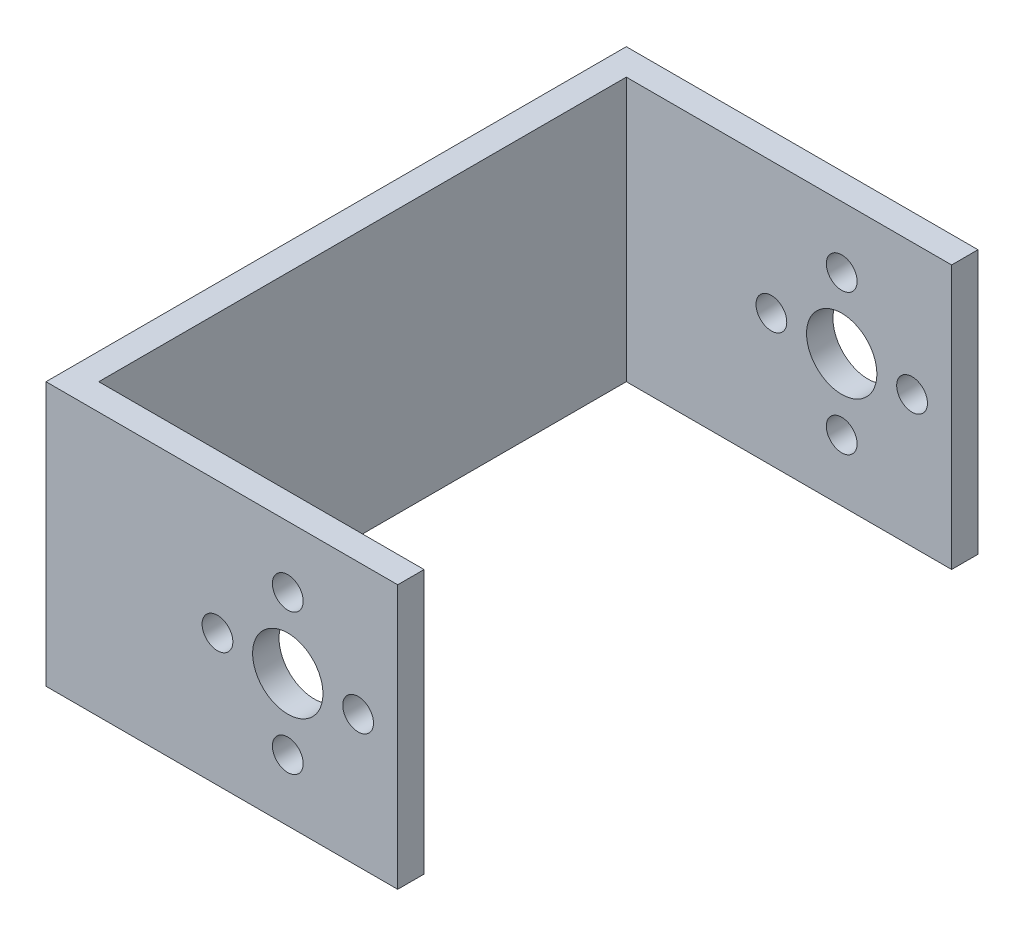
ISO-10303-21;
HEADER;
FILE_DESCRIPTION(('STEP AP214'),'2;1');
FILE_NAME('part.step','',(''),(''),'','','');
FILE_SCHEMA(('AUTOMOTIVE_DESIGN { 1 0 10303 214 1 1 1 1 }'));
ENDSEC;
DATA;
#1=APPLICATION_CONTEXT('core data for automotive mechanical design processes');
#2=APPLICATION_PROTOCOL_DEFINITION('international standard','automotive_design',2000,#1);
#3=PRODUCT_CONTEXT('',#1,'mechanical');
#4=PRODUCT('Part','Part','',(#3));
#5=PRODUCT_RELATED_PRODUCT_CATEGORY('part','',(#4));
#6=PRODUCT_DEFINITION_FORMATION('','',#4);
#7=PRODUCT_DEFINITION_CONTEXT('part definition',#1,'design');
#8=PRODUCT_DEFINITION('design','',#6,#7);
#9=PRODUCT_DEFINITION_SHAPE('','',#8);
#10=(LENGTH_UNIT() NAMED_UNIT(*) SI_UNIT(.MILLI.,.METRE.));
#11=(NAMED_UNIT(*) PLANE_ANGLE_UNIT() SI_UNIT($,.RADIAN.));
#12=(NAMED_UNIT(*) SI_UNIT($,.STERADIAN.) SOLID_ANGLE_UNIT());
#13=UNCERTAINTY_MEASURE_WITH_UNIT(LENGTH_MEASURE(1.E-05),#10,'distance_accuracy_value','');
#14=(GEOMETRIC_REPRESENTATION_CONTEXT(3) GLOBAL_UNCERTAINTY_ASSIGNED_CONTEXT((#13)) GLOBAL_UNIT_ASSIGNED_CONTEXT((#10,
#11,#12)) REPRESENTATION_CONTEXT('',''));
#15=CARTESIAN_POINT('',(0.,0.,0.));
#16=DIRECTION('',(0.,0.,1.));
#17=DIRECTION('',(1.,0.,0.));
#18=AXIS2_PLACEMENT_3D('',#15,#16,#17);
#19=CARTESIAN_POINT('',(40.,30.,0.));
#20=DIRECTION('',(0.,0.,-1.));
#21=DIRECTION('',(-1.,0.,0.));
#22=AXIS2_PLACEMENT_3D('',#19,#20,#21);
#23=PLANE('',#22);
#24=CARTESIAN_POINT('',(19.5,15.,0.));
#25=DIRECTION('',(0.,0.,1.));
#26=DIRECTION('',(1.,0.,0.));
#27=AXIS2_PLACEMENT_3D('',#24,#25,#26);
#28=CIRCLE('',#27,1.75);
#29=CARTESIAN_POINT('',(21.25,15.,0.));
#30=VERTEX_POINT('',#29);
#31=EDGE_CURVE('E264',#30,#30,#28,.T.);
#32=ORIENTED_EDGE('',*,*,#31,.F.);
#33=EDGE_LOOP('',(#32));
#34=FACE_BOUND('',#33,.T.);
#35=CARTESIAN_POINT('',(27.5,23.,0.));
#36=DIRECTION('',(0.,0.,1.));
#37=DIRECTION('',(1.,0.,0.));
#38=AXIS2_PLACEMENT_3D('',#35,#36,#37);
#39=CIRCLE('',#38,1.75);
#40=CARTESIAN_POINT('',(29.25,23.,0.));
#41=VERTEX_POINT('',#40);
#42=EDGE_CURVE('E255',#41,#41,#39,.T.);
#43=ORIENTED_EDGE('',*,*,#42,.F.);
#44=EDGE_LOOP('',(#43));
#45=FACE_BOUND('',#44,.T.);
#46=CARTESIAN_POINT('',(35.5,15.,0.));
#47=DIRECTION('',(0.,0.,1.));
#48=DIRECTION('',(1.,0.,0.));
#49=AXIS2_PLACEMENT_3D('',#46,#47,#48);
#50=CIRCLE('',#49,1.75);
#51=CARTESIAN_POINT('',(37.25,15.,0.));
#52=VERTEX_POINT('',#51);
#53=EDGE_CURVE('E279',#52,#52,#50,.T.);
#54=ORIENTED_EDGE('',*,*,#53,.F.);
#55=EDGE_LOOP('',(#54));
#56=FACE_BOUND('',#55,.T.);
#57=CARTESIAN_POINT('',(27.5,6.99999999999997,0.));
#58=DIRECTION('',(0.,0.,1.));
#59=DIRECTION('',(1.,0.,0.));
#60=AXIS2_PLACEMENT_3D('',#57,#58,#59);
#61=CIRCLE('',#60,1.75);
#62=CARTESIAN_POINT('',(29.25,6.99999999999997,0.));
#63=VERTEX_POINT('',#62);
#64=EDGE_CURVE('E271',#63,#63,#61,.T.);
#65=ORIENTED_EDGE('',*,*,#64,.F.);
#66=EDGE_LOOP('',(#65));
#67=FACE_BOUND('',#66,.T.);
#68=CARTESIAN_POINT('',(27.5,15.,0.));
#69=DIRECTION('',(0.,0.,1.));
#70=DIRECTION('',(1.,0.,0.));
#71=AXIS2_PLACEMENT_3D('',#68,#69,#70);
#72=CIRCLE('',#71,4.00000000000001);
#73=CARTESIAN_POINT('',(31.5,15.,0.));
#74=VERTEX_POINT('',#73);
#75=EDGE_CURVE('E247',#74,#74,#72,.T.);
#76=ORIENTED_EDGE('',*,*,#75,.F.);
#77=EDGE_LOOP('',(#76));
#78=FACE_BOUND('',#77,.T.);
#79=DIRECTION('',(1.,0.,0.));
#80=VECTOR('',#79,1.);
#81=CARTESIAN_POINT('',(40.,0.,0.));
#82=LINE('',#81,#80);
#83=CARTESIAN_POINT('',(0.,0.,0.));
#84=VERTEX_POINT('',#83);
#85=CARTESIAN_POINT('',(40.,0.,0.));
#86=VERTEX_POINT('',#85);
#87=EDGE_CURVE('E140',#84,#86,#82,.T.);
#88=ORIENTED_EDGE('',*,*,#87,.T.);
#89=DIRECTION('',(0.,-1.,0.));
#90=VECTOR('',#89,1.);
#91=CARTESIAN_POINT('',(40.,30.,0.));
#92=LINE('',#91,#90);
#93=CARTESIAN_POINT('',(40.,30.,0.));
#94=VERTEX_POINT('',#93);
#95=EDGE_CURVE('E11',#94,#86,#92,.T.);
#96=ORIENTED_EDGE('',*,*,#95,.F.);
#97=DIRECTION('',(1.,0.,0.));
#98=VECTOR('',#97,1.);
#99=CARTESIAN_POINT('',(40.,30.,0.));
#100=LINE('',#99,#98);
#101=CARTESIAN_POINT('',(0.,30.,0.));
#102=VERTEX_POINT('',#101);
#103=EDGE_CURVE('E163',#102,#94,#100,.T.);
#104=ORIENTED_EDGE('',*,*,#103,.F.);
#105=DIRECTION('',(0.,-1.,0.));
#106=VECTOR('',#105,1.);
#107=CARTESIAN_POINT('',(0.,30.,0.));
#108=LINE('',#107,#106);
#109=EDGE_CURVE('E136',#102,#84,#108,.T.);
#110=ORIENTED_EDGE('',*,*,#109,.T.);
#111=EDGE_LOOP('',(#88,#96,#104,#110));
#112=FACE_BOUND('',#111,.T.);
#113=ADVANCED_FACE('F39',(#34,#45,#56,#67,#78,#112),#23,.F.);
#114=CARTESIAN_POINT('',(40.,30.,-3.));
#115=DIRECTION('',(-1.,0.,0.));
#116=DIRECTION('',(0.,0.,1.));
#117=AXIS2_PLACEMENT_3D('',#114,#115,#116);
#118=PLANE('',#117);
#119=DIRECTION('',(0.,0.,-1.));
#120=VECTOR('',#119,1.);
#121=CARTESIAN_POINT('',(40.,0.,-3.));
#122=LINE('',#121,#120);
#123=CARTESIAN_POINT('',(40.,0.,-3.));
#124=VERTEX_POINT('',#123);
#125=EDGE_CURVE('E144',#86,#124,#122,.T.);
#126=ORIENTED_EDGE('',*,*,#125,.T.);
#127=DIRECTION('',(0.,-1.,0.));
#128=VECTOR('',#127,1.);
#129=CARTESIAN_POINT('',(40.,30.,-3.));
#130=LINE('',#129,#128);
#131=CARTESIAN_POINT('',(40.,30.,-3.));
#132=VERTEX_POINT('',#131);
#133=EDGE_CURVE('E48',#132,#124,#130,.T.);
#134=ORIENTED_EDGE('',*,*,#133,.F.);
#135=DIRECTION('',(0.,0.,-1.));
#136=VECTOR('',#135,1.);
#137=CARTESIAN_POINT('',(40.,30.,-3.));
#138=LINE('',#137,#136);
#139=EDGE_CURVE('E99',#94,#132,#138,.T.);
#140=ORIENTED_EDGE('',*,*,#139,.F.);
#141=ORIENTED_EDGE('',*,*,#95,.T.);
#142=EDGE_LOOP('',(#126,#134,#140,#141));
#143=FACE_BOUND('',#142,.T.);
#144=ADVANCED_FACE('F326',(#143),#118,.F.);
#145=CARTESIAN_POINT('',(3.,30.,-3.));
#146=DIRECTION('',(0.,0.,1.));
#147=DIRECTION('',(1.,0.,0.));
#148=AXIS2_PLACEMENT_3D('',#145,#146,#147);
#149=PLANE('',#148);
#150=CARTESIAN_POINT('',(19.5,15.,-3.));
#151=DIRECTION('',(0.,0.,1.));
#152=DIRECTION('',(1.,0.,0.));
#153=AXIS2_PLACEMENT_3D('',#150,#151,#152);
#154=CIRCLE('',#153,1.75);
#155=CARTESIAN_POINT('',(21.25,15.,-3.));
#156=VERTEX_POINT('',#155);
#157=EDGE_CURVE('E145',#156,#156,#154,.T.);
#158=ORIENTED_EDGE('',*,*,#157,.T.);
#159=EDGE_LOOP('',(#158));
#160=FACE_BOUND('',#159,.T.);
#161=CARTESIAN_POINT('',(27.5,23.,-3.));
#162=DIRECTION('',(0.,0.,1.));
#163=DIRECTION('',(1.,0.,0.));
#164=AXIS2_PLACEMENT_3D('',#161,#162,#163);
#165=CIRCLE('',#164,1.75);
#166=CARTESIAN_POINT('',(29.25,23.,-3.));
#167=VERTEX_POINT('',#166);
#168=EDGE_CURVE('E214',#167,#167,#165,.T.);
#169=ORIENTED_EDGE('',*,*,#168,.T.);
#170=EDGE_LOOP('',(#169));
#171=FACE_BOUND('',#170,.T.);
#172=CARTESIAN_POINT('',(35.5,15.,-3.00000000000002));
#173=DIRECTION('',(0.,0.,1.));
#174=DIRECTION('',(1.,0.,0.));
#175=AXIS2_PLACEMENT_3D('',#172,#173,#174);
#176=CIRCLE('',#175,1.75);
#177=CARTESIAN_POINT('',(37.25,15.,-3.00000000000002));
#178=VERTEX_POINT('',#177);
#179=EDGE_CURVE('E222',#178,#178,#176,.T.);
#180=ORIENTED_EDGE('',*,*,#179,.T.);
#181=EDGE_LOOP('',(#180));
#182=FACE_BOUND('',#181,.T.);
#183=CARTESIAN_POINT('',(27.5,6.99999999999997,-3.));
#184=DIRECTION('',(0.,0.,1.));
#185=DIRECTION('',(1.,0.,0.));
#186=AXIS2_PLACEMENT_3D('',#183,#184,#185);
#187=CIRCLE('',#186,1.75);
#188=CARTESIAN_POINT('',(29.25,6.99999999999997,-3.));
#189=VERTEX_POINT('',#188);
#190=EDGE_CURVE('E230',#189,#189,#187,.T.);
#191=ORIENTED_EDGE('',*,*,#190,.T.);
#192=EDGE_LOOP('',(#191));
#193=FACE_BOUND('',#192,.T.);
#194=CARTESIAN_POINT('',(27.5,15.,-3.));
#195=DIRECTION('',(0.,0.,1.));
#196=DIRECTION('',(1.,0.,0.));
#197=AXIS2_PLACEMENT_3D('',#194,#195,#196);
#198=CIRCLE('',#197,4.00000000000001);
#199=CARTESIAN_POINT('',(31.5,15.,-3.));
#200=VERTEX_POINT('',#199);
#201=EDGE_CURVE('E238',#200,#200,#198,.T.);
#202=ORIENTED_EDGE('',*,*,#201,.T.);
#203=EDGE_LOOP('',(#202));
#204=FACE_BOUND('',#203,.T.);
#205=DIRECTION('',(-1.,0.,0.));
#206=VECTOR('',#205,1.);
#207=CARTESIAN_POINT('',(3.,0.,-3.));
#208=LINE('',#207,#206);
#209=CARTESIAN_POINT('',(3.,0.,-3.));
#210=VERTEX_POINT('',#209);
#211=EDGE_CURVE('E148',#124,#210,#208,.T.);
#212=ORIENTED_EDGE('',*,*,#211,.T.);
#213=DIRECTION('',(0.,-1.,0.));
#214=VECTOR('',#213,1.);
#215=CARTESIAN_POINT('',(3.,30.,-3.));
#216=LINE('',#215,#214);
#217=CARTESIAN_POINT('',(3.,30.,-3.));
#218=VERTEX_POINT('',#217);
#219=EDGE_CURVE('E174',#218,#210,#216,.T.);
#220=ORIENTED_EDGE('',*,*,#219,.F.);
#221=DIRECTION('',(-1.,0.,0.));
#222=VECTOR('',#221,1.);
#223=CARTESIAN_POINT('',(3.,30.,-3.));
#224=LINE('',#223,#222);
#225=EDGE_CURVE('E184',#132,#218,#224,.T.);
#226=ORIENTED_EDGE('',*,*,#225,.F.);
#227=ORIENTED_EDGE('',*,*,#133,.T.);
#228=EDGE_LOOP('',(#212,#220,#226,#227));
#229=FACE_BOUND('',#228,.T.);
#230=ADVANCED_FACE('F182',(#160,#171,#182,#193,#204,#229),#149,.F.);
#231=CARTESIAN_POINT('',(2.99999999999999,30.,-63.));
#232=DIRECTION('',(-1.,0.,0.));
#233=DIRECTION('',(0.,0.,1.));
#234=AXIS2_PLACEMENT_3D('',#231,#232,#233);
#235=PLANE('',#234);
#236=DIRECTION('',(0.,0.,-1.));
#237=VECTOR('',#236,1.);
#238=CARTESIAN_POINT('',(2.99999999999999,0.,-63.));
#239=LINE('',#238,#237);
#240=CARTESIAN_POINT('',(2.99999999999999,0.,-63.));
#241=VERTEX_POINT('',#240);
#242=EDGE_CURVE('E151',#210,#241,#239,.T.);
#243=ORIENTED_EDGE('',*,*,#242,.T.);
#244=DIRECTION('',(0.,-1.,0.));
#245=VECTOR('',#244,1.);
#246=CARTESIAN_POINT('',(2.99999999999999,30.,-63.));
#247=LINE('',#246,#245);
#248=CARTESIAN_POINT('',(2.99999999999999,30.,-63.));
#249=VERTEX_POINT('',#248);
#250=EDGE_CURVE('E170',#249,#241,#247,.T.);
#251=ORIENTED_EDGE('',*,*,#250,.F.);
#252=DIRECTION('',(0.,0.,-1.));
#253=VECTOR('',#252,1.);
#254=CARTESIAN_POINT('',(2.99999999999999,30.,-63.));
#255=LINE('',#254,#253);
#256=EDGE_CURVE('E197',#218,#249,#255,.T.);
#257=ORIENTED_EDGE('',*,*,#256,.F.);
#258=ORIENTED_EDGE('',*,*,#219,.T.);
#259=EDGE_LOOP('',(#243,#251,#257,#258));
#260=FACE_BOUND('',#259,.T.);
#261=ADVANCED_FACE('F192',(#260),#235,.F.);
#262=CARTESIAN_POINT('',(2.99999999999999,30.,-63.));
#263=DIRECTION('',(0.,0.,-1.));
#264=DIRECTION('',(-1.,0.,0.));
#265=AXIS2_PLACEMENT_3D('',#262,#263,#264);
#266=PLANE('',#265);
#267=CARTESIAN_POINT('',(19.5,15.,-63.));
#268=DIRECTION('',(0.,0.,-1.));
#269=DIRECTION('',(-1.,0.,0.));
#270=AXIS2_PLACEMENT_3D('',#267,#268,#269);
#271=CIRCLE('',#270,1.75);
#272=CARTESIAN_POINT('',(17.75,15.,-63.));
#273=VERTEX_POINT('',#272);
#274=EDGE_CURVE('E210',#273,#273,#271,.T.);
#275=ORIENTED_EDGE('',*,*,#274,.T.);
#276=EDGE_LOOP('',(#275));
#277=FACE_BOUND('',#276,.T.);
#278=CARTESIAN_POINT('',(27.5,23.,-63.));
#279=DIRECTION('',(0.,0.,-1.));
#280=DIRECTION('',(-1.,0.,0.));
#281=AXIS2_PLACEMENT_3D('',#278,#279,#280);
#282=CIRCLE('',#281,1.75);
#283=CARTESIAN_POINT('',(25.75,23.,-63.));
#284=VERTEX_POINT('',#283);
#285=EDGE_CURVE('E218',#284,#284,#282,.T.);
#286=ORIENTED_EDGE('',*,*,#285,.T.);
#287=EDGE_LOOP('',(#286));
#288=FACE_BOUND('',#287,.T.);
#289=CARTESIAN_POINT('',(35.5,15.,-63.));
#290=DIRECTION('',(0.,0.,-1.));
#291=DIRECTION('',(-1.,0.,0.));
#292=AXIS2_PLACEMENT_3D('',#289,#290,#291);
#293=CIRCLE('',#292,1.75);
#294=CARTESIAN_POINT('',(33.75,15.,-63.));
#295=VERTEX_POINT('',#294);
#296=EDGE_CURVE('E226',#295,#295,#293,.T.);
#297=ORIENTED_EDGE('',*,*,#296,.T.);
#298=EDGE_LOOP('',(#297));
#299=FACE_BOUND('',#298,.T.);
#300=CARTESIAN_POINT('',(27.5,6.99999999999997,-63.));
#301=DIRECTION('',(0.,0.,-1.));
#302=DIRECTION('',(-1.,0.,0.));
#303=AXIS2_PLACEMENT_3D('',#300,#301,#302);
#304=CIRCLE('',#303,1.75);
#305=CARTESIAN_POINT('',(25.75,6.99999999999997,-63.));
#306=VERTEX_POINT('',#305);
#307=EDGE_CURVE('E234',#306,#306,#304,.T.);
#308=ORIENTED_EDGE('',*,*,#307,.T.);
#309=EDGE_LOOP('',(#308));
#310=FACE_BOUND('',#309,.T.);
#311=CARTESIAN_POINT('',(27.5,15.,-63.));
#312=DIRECTION('',(0.,0.,-1.));
#313=DIRECTION('',(-1.,0.,0.));
#314=AXIS2_PLACEMENT_3D('',#311,#312,#313);
#315=CIRCLE('',#314,4.00000000000001);
#316=CARTESIAN_POINT('',(23.5,15.,-63.));
#317=VERTEX_POINT('',#316);
#318=EDGE_CURVE('E242',#317,#317,#315,.T.);
#319=ORIENTED_EDGE('',*,*,#318,.T.);
#320=EDGE_LOOP('',(#319));
#321=FACE_BOUND('',#320,.T.);
#322=DIRECTION('',(1.,0.,0.));
#323=VECTOR('',#322,1.);
#324=CARTESIAN_POINT('',(2.99999999999999,0.,-63.));
#325=LINE('',#324,#323);
#326=CARTESIAN_POINT('',(40.,0.,-63.));
#327=VERTEX_POINT('',#326);
#328=EDGE_CURVE('E154',#241,#327,#325,.T.);
#329=ORIENTED_EDGE('',*,*,#328,.T.);
#330=DIRECTION('',(0.,-1.,0.));
#331=VECTOR('',#330,1.);
#332=CARTESIAN_POINT('',(40.,30.,-63.));
#333=LINE('',#332,#331);
#334=CARTESIAN_POINT('',(40.,30.,-63.));
#335=VERTEX_POINT('',#334);
#336=EDGE_CURVE('E129',#335,#327,#333,.T.);
#337=ORIENTED_EDGE('',*,*,#336,.F.);
#338=DIRECTION('',(1.,0.,0.));
#339=VECTOR('',#338,1.);
#340=CARTESIAN_POINT('',(2.99999999999999,30.,-63.));
#341=LINE('',#340,#339);
#342=EDGE_CURVE('E118',#249,#335,#341,.T.);
#343=ORIENTED_EDGE('',*,*,#342,.F.);
#344=ORIENTED_EDGE('',*,*,#250,.T.);
#345=EDGE_LOOP('',(#329,#337,#343,#344));
#346=FACE_BOUND('',#345,.T.);
#347=ADVANCED_FACE('F195',(#277,#288,#299,#310,#321,#346),#266,.F.);
#348=CARTESIAN_POINT('',(40.,30.,-63.));
#349=DIRECTION('',(-1.,0.,0.));
#350=DIRECTION('',(0.,0.,1.));
#351=AXIS2_PLACEMENT_3D('',#348,#349,#350);
#352=PLANE('',#351);
#353=DIRECTION('',(0.,0.,-1.));
#354=VECTOR('',#353,1.);
#355=CARTESIAN_POINT('',(40.,0.,-63.));
#356=LINE('',#355,#354);
#357=CARTESIAN_POINT('',(40.,0.,-66.));
#358=VERTEX_POINT('',#357);
#359=EDGE_CURVE('E127',#327,#358,#356,.T.);
#360=ORIENTED_EDGE('',*,*,#359,.T.);
#361=DIRECTION('',(0.,-1.,0.));
#362=VECTOR('',#361,1.);
#363=CARTESIAN_POINT('',(40.,30.,-66.));
#364=LINE('',#363,#362);
#365=CARTESIAN_POINT('',(40.,30.,-66.));
#366=VERTEX_POINT('',#365);
#367=EDGE_CURVE('E124',#366,#358,#364,.T.);
#368=ORIENTED_EDGE('',*,*,#367,.F.);
#369=DIRECTION('',(0.,0.,-1.));
#370=VECTOR('',#369,1.);
#371=CARTESIAN_POINT('',(40.,30.,-63.));
#372=LINE('',#371,#370);
#373=EDGE_CURVE('E112',#335,#366,#372,.T.);
#374=ORIENTED_EDGE('',*,*,#373,.F.);
#375=ORIENTED_EDGE('',*,*,#336,.T.);
#376=EDGE_LOOP('',(#360,#368,#374,#375));
#377=FACE_BOUND('',#376,.T.);
#378=ADVANCED_FACE('F125',(#377),#352,.F.);
#379=CARTESIAN_POINT('',(40.,30.,-66.));
#380=DIRECTION('',(0.,0.,1.));
#381=DIRECTION('',(1.,0.,0.));
#382=AXIS2_PLACEMENT_3D('',#379,#380,#381);
#383=PLANE('',#382);
#384=CARTESIAN_POINT('',(19.5,15.,-66.));
#385=DIRECTION('',(0.,0.,1.));
#386=DIRECTION('',(1.,0.,0.));
#387=AXIS2_PLACEMENT_3D('',#384,#385,#386);
#388=CIRCLE('',#387,1.75);
#389=CARTESIAN_POINT('',(21.25,15.,-66.));
#390=VERTEX_POINT('',#389);
#391=EDGE_CURVE('E251',#390,#390,#388,.T.);
#392=ORIENTED_EDGE('',*,*,#391,.T.);
#393=EDGE_LOOP('',(#392));
#394=FACE_BOUND('',#393,.T.);
#395=CARTESIAN_POINT('',(27.5,23.,-66.));
#396=DIRECTION('',(0.,0.,1.));
#397=DIRECTION('',(1.,0.,0.));
#398=AXIS2_PLACEMENT_3D('',#395,#396,#397);
#399=CIRCLE('',#398,1.75);
#400=CARTESIAN_POINT('',(29.25,23.,-66.));
#401=VERTEX_POINT('',#400);
#402=EDGE_CURVE('E259',#401,#401,#399,.T.);
#403=ORIENTED_EDGE('',*,*,#402,.T.);
#404=EDGE_LOOP('',(#403));
#405=FACE_BOUND('',#404,.T.);
#406=CARTESIAN_POINT('',(35.5,15.,-66.));
#407=DIRECTION('',(0.,0.,1.));
#408=DIRECTION('',(1.,0.,0.));
#409=AXIS2_PLACEMENT_3D('',#406,#407,#408);
#410=CIRCLE('',#409,1.75);
#411=CARTESIAN_POINT('',(37.25,15.,-66.));
#412=VERTEX_POINT('',#411);
#413=EDGE_CURVE('E260',#412,#412,#410,.T.);
#414=ORIENTED_EDGE('',*,*,#413,.T.);
#415=EDGE_LOOP('',(#414));
#416=FACE_BOUND('',#415,.T.);
#417=CARTESIAN_POINT('',(27.5,6.99999999999997,-66.));
#418=DIRECTION('',(0.,0.,1.));
#419=DIRECTION('',(1.,0.,0.));
#420=AXIS2_PLACEMENT_3D('',#417,#418,#419);
#421=CIRCLE('',#420,1.75);
#422=CARTESIAN_POINT('',(29.25,6.99999999999997,-66.));
#423=VERTEX_POINT('',#422);
#424=EDGE_CURVE('E275',#423,#423,#421,.T.);
#425=ORIENTED_EDGE('',*,*,#424,.T.);
#426=EDGE_LOOP('',(#425));
#427=FACE_BOUND('',#426,.T.);
#428=CARTESIAN_POINT('',(27.5,15.,-66.));
#429=DIRECTION('',(0.,0.,1.));
#430=DIRECTION('',(1.,0.,0.));
#431=AXIS2_PLACEMENT_3D('',#428,#429,#430);
#432=CIRCLE('',#431,4.00000000000001);
#433=CARTESIAN_POINT('',(31.5,15.,-66.));
#434=VERTEX_POINT('',#433);
#435=EDGE_CURVE('E246',#434,#434,#432,.T.);
#436=ORIENTED_EDGE('',*,*,#435,.T.);
#437=EDGE_LOOP('',(#436));
#438=FACE_BOUND('',#437,.T.);
#439=DIRECTION('',(-1.,0.,0.));
#440=VECTOR('',#439,1.);
#441=CARTESIAN_POINT('',(40.,0.,-66.));
#442=LINE('',#441,#440);
#443=CARTESIAN_POINT('',(0.,0.,-66.));
#444=VERTEX_POINT('',#443);
#445=EDGE_CURVE('E85',#358,#444,#442,.T.);
#446=ORIENTED_EDGE('',*,*,#445,.T.);
#447=DIRECTION('',(0.,-1.,0.));
#448=VECTOR('',#447,1.);
#449=CARTESIAN_POINT('',(0.,30.,-66.));
#450=LINE('',#449,#448);
#451=CARTESIAN_POINT('',(0.,30.,-66.));
#452=VERTEX_POINT('',#451);
#453=EDGE_CURVE('E130',#452,#444,#450,.T.);
#454=ORIENTED_EDGE('',*,*,#453,.F.);
#455=DIRECTION('',(-1.,0.,0.));
#456=VECTOR('',#455,1.);
#457=CARTESIAN_POINT('',(40.,30.,-66.));
#458=LINE('',#457,#456);
#459=EDGE_CURVE('E116',#366,#452,#458,.T.);
#460=ORIENTED_EDGE('',*,*,#459,.F.);
#461=ORIENTED_EDGE('',*,*,#367,.T.);
#462=EDGE_LOOP('',(#446,#454,#460,#461));
#463=FACE_BOUND('',#462,.T.);
#464=ADVANCED_FACE('F132',(#394,#405,#416,#427,#438,#463),#383,.F.);
#465=CARTESIAN_POINT('',(0.,30.,0.));
#466=DIRECTION('',(1.,0.,0.));
#467=DIRECTION('',(0.,0.,-1.));
#468=AXIS2_PLACEMENT_3D('',#465,#466,#467);
#469=PLANE('',#468);
#470=DIRECTION('',(0.,0.,1.));
#471=VECTOR('',#470,1.);
#472=CARTESIAN_POINT('',(0.,0.,0.));
#473=LINE('',#472,#471);
#474=EDGE_CURVE('E91',#444,#84,#473,.T.);
#475=ORIENTED_EDGE('',*,*,#474,.T.);
#476=ORIENTED_EDGE('',*,*,#109,.F.);
#477=DIRECTION('',(0.,0.,1.));
#478=VECTOR('',#477,1.);
#479=CARTESIAN_POINT('',(0.,30.,0.));
#480=LINE('',#479,#478);
#481=EDGE_CURVE('E56',#452,#102,#480,.T.);
#482=ORIENTED_EDGE('',*,*,#481,.F.);
#483=ORIENTED_EDGE('',*,*,#453,.T.);
#484=EDGE_LOOP('',(#475,#476,#482,#483));
#485=FACE_BOUND('',#484,.T.);
#486=ADVANCED_FACE('F343',(#485),#469,.F.);
#487=CARTESIAN_POINT('',(0.,30.,0.));
#488=DIRECTION('',(0.,-1.,0.));
#489=DIRECTION('',(0.,0.,-1.));
#490=AXIS2_PLACEMENT_3D('',#487,#488,#489);
#491=PLANE('',#490);
#492=ORIENTED_EDGE('',*,*,#103,.T.);
#493=ORIENTED_EDGE('',*,*,#139,.T.);
#494=ORIENTED_EDGE('',*,*,#225,.T.);
#495=ORIENTED_EDGE('',*,*,#256,.T.);
#496=ORIENTED_EDGE('',*,*,#342,.T.);
#497=ORIENTED_EDGE('',*,*,#373,.T.);
#498=ORIENTED_EDGE('',*,*,#459,.T.);
#499=ORIENTED_EDGE('',*,*,#481,.T.);
#500=EDGE_LOOP('',(#492,#493,#494,#495,#496,#497,#498,#499));
#501=FACE_BOUND('',#500,.T.);
#502=ADVANCED_FACE('F114',(#501),#491,.F.);
#503=CARTESIAN_POINT('',(0.,0.,0.));
#504=DIRECTION('',(0.,-1.,0.));
#505=DIRECTION('',(0.,0.,-1.));
#506=AXIS2_PLACEMENT_3D('',#503,#504,#505);
#507=PLANE('',#506);
#508=ORIENTED_EDGE('',*,*,#87,.F.);
#509=ORIENTED_EDGE('',*,*,#474,.F.);
#510=ORIENTED_EDGE('',*,*,#445,.F.);
#511=ORIENTED_EDGE('',*,*,#359,.F.);
#512=ORIENTED_EDGE('',*,*,#328,.F.);
#513=ORIENTED_EDGE('',*,*,#242,.F.);
#514=ORIENTED_EDGE('',*,*,#211,.F.);
#515=ORIENTED_EDGE('',*,*,#125,.F.);
#516=EDGE_LOOP('',(#508,#509,#510,#511,#512,#513,#514,#515));
#517=FACE_BOUND('',#516,.T.);
#518=ADVANCED_FACE('F188',(#517),#507,.T.);
#519=CARTESIAN_POINT('',(27.5,15.,-66.));
#520=DIRECTION('',(0.,0.,1.));
#521=DIRECTION('',(1.,0.,0.));
#522=AXIS2_PLACEMENT_3D('',#519,#520,#521);
#523=CYLINDRICAL_SURFACE('',#522,4.00000000000001);
#524=ORIENTED_EDGE('',*,*,#435,.F.);
#525=EDGE_LOOP('',(#524));
#526=FACE_BOUND('',#525,.T.);
#527=ORIENTED_EDGE('',*,*,#318,.F.);
#528=EDGE_LOOP('',(#527));
#529=FACE_BOUND('',#528,.T.);
#530=ADVANCED_FACE('F306',(#526,#529),#523,.F.);
#531=CARTESIAN_POINT('',(27.5,6.99999999999997,-66.));
#532=DIRECTION('',(0.,0.,1.));
#533=DIRECTION('',(1.,0.,0.));
#534=AXIS2_PLACEMENT_3D('',#531,#532,#533);
#535=CYLINDRICAL_SURFACE('',#534,1.75);
#536=ORIENTED_EDGE('',*,*,#424,.F.);
#537=EDGE_LOOP('',(#536));
#538=FACE_BOUND('',#537,.T.);
#539=ORIENTED_EDGE('',*,*,#307,.F.);
#540=EDGE_LOOP('',(#539));
#541=FACE_BOUND('',#540,.T.);
#542=ADVANCED_FACE('F293',(#538,#541),#535,.F.);
#543=CARTESIAN_POINT('',(35.5,15.,-66.));
#544=DIRECTION('',(0.,0.,1.));
#545=DIRECTION('',(1.,0.,0.));
#546=AXIS2_PLACEMENT_3D('',#543,#544,#545);
#547=CYLINDRICAL_SURFACE('',#546,1.75);
#548=ORIENTED_EDGE('',*,*,#413,.F.);
#549=EDGE_LOOP('',(#548));
#550=FACE_BOUND('',#549,.T.);
#551=ORIENTED_EDGE('',*,*,#296,.F.);
#552=EDGE_LOOP('',(#551));
#553=FACE_BOUND('',#552,.T.);
#554=ADVANCED_FACE('F289',(#550,#553),#547,.F.);
#555=CARTESIAN_POINT('',(27.5,23.,-66.));
#556=DIRECTION('',(0.,0.,1.));
#557=DIRECTION('',(1.,0.,0.));
#558=AXIS2_PLACEMENT_3D('',#555,#556,#557);
#559=CYLINDRICAL_SURFACE('',#558,1.75);
#560=ORIENTED_EDGE('',*,*,#402,.F.);
#561=EDGE_LOOP('',(#560));
#562=FACE_BOUND('',#561,.T.);
#563=ORIENTED_EDGE('',*,*,#285,.F.);
#564=EDGE_LOOP('',(#563));
#565=FACE_BOUND('',#564,.T.);
#566=ADVANCED_FACE('F292',(#562,#565),#559,.F.);
#567=CARTESIAN_POINT('',(19.5,15.,-66.));
#568=DIRECTION('',(0.,0.,1.));
#569=DIRECTION('',(1.,0.,0.));
#570=AXIS2_PLACEMENT_3D('',#567,#568,#569);
#571=CYLINDRICAL_SURFACE('',#570,1.75);
#572=ORIENTED_EDGE('',*,*,#391,.F.);
#573=EDGE_LOOP('',(#572));
#574=FACE_BOUND('',#573,.T.);
#575=ORIENTED_EDGE('',*,*,#274,.F.);
#576=EDGE_LOOP('',(#575));
#577=FACE_BOUND('',#576,.T.);
#578=ADVANCED_FACE('F323',(#574,#577),#571,.F.);
#579=ORIENTED_EDGE('',*,*,#75,.T.);
#580=EDGE_LOOP('',(#579));
#581=FACE_BOUND('',#580,.T.);
#582=ORIENTED_EDGE('',*,*,#201,.F.);
#583=EDGE_LOOP('',(#582));
#584=FACE_BOUND('',#583,.T.);
#585=ADVANCED_FACE('F310',(#581,#584),#523,.F.);
#586=ORIENTED_EDGE('',*,*,#64,.T.);
#587=EDGE_LOOP('',(#586));
#588=FACE_BOUND('',#587,.T.);
#589=ORIENTED_EDGE('',*,*,#190,.F.);
#590=EDGE_LOOP('',(#589));
#591=FACE_BOUND('',#590,.T.);
#592=ADVANCED_FACE('F317',(#588,#591),#535,.F.);
#593=ORIENTED_EDGE('',*,*,#53,.T.);
#594=EDGE_LOOP('',(#593));
#595=FACE_BOUND('',#594,.T.);
#596=ORIENTED_EDGE('',*,*,#179,.F.);
#597=EDGE_LOOP('',(#596));
#598=FACE_BOUND('',#597,.T.);
#599=ADVANCED_FACE('F295',(#595,#598),#547,.F.);
#600=ORIENTED_EDGE('',*,*,#42,.T.);
#601=EDGE_LOOP('',(#600));
#602=FACE_BOUND('',#601,.T.);
#603=ORIENTED_EDGE('',*,*,#168,.F.);
#604=EDGE_LOOP('',(#603));
#605=FACE_BOUND('',#604,.T.);
#606=ADVANCED_FACE('F377',(#602,#605),#559,.F.);
#607=ORIENTED_EDGE('',*,*,#31,.T.);
#608=EDGE_LOOP('',(#607));
#609=FACE_BOUND('',#608,.T.);
#610=ORIENTED_EDGE('',*,*,#157,.F.);
#611=EDGE_LOOP('',(#610));
#612=FACE_BOUND('',#611,.T.);
#613=ADVANCED_FACE('F380',(#609,#612),#571,.F.);
#614=CLOSED_SHELL('',(#113,#144,#230,#261,#347,#378,#464,#486,#502,#518,#530,#542,#554,#566,
#578,#585,#592,#599,#606,#613));
#615=MANIFOLD_SOLID_BREP('B2',#614);
#616=ADVANCED_BREP_SHAPE_REPRESENTATION('',(#18,#615),#14);
#617=SHAPE_DEFINITION_REPRESENTATION(#9,#616);
ENDSEC;
END-ISO-10303-21;
